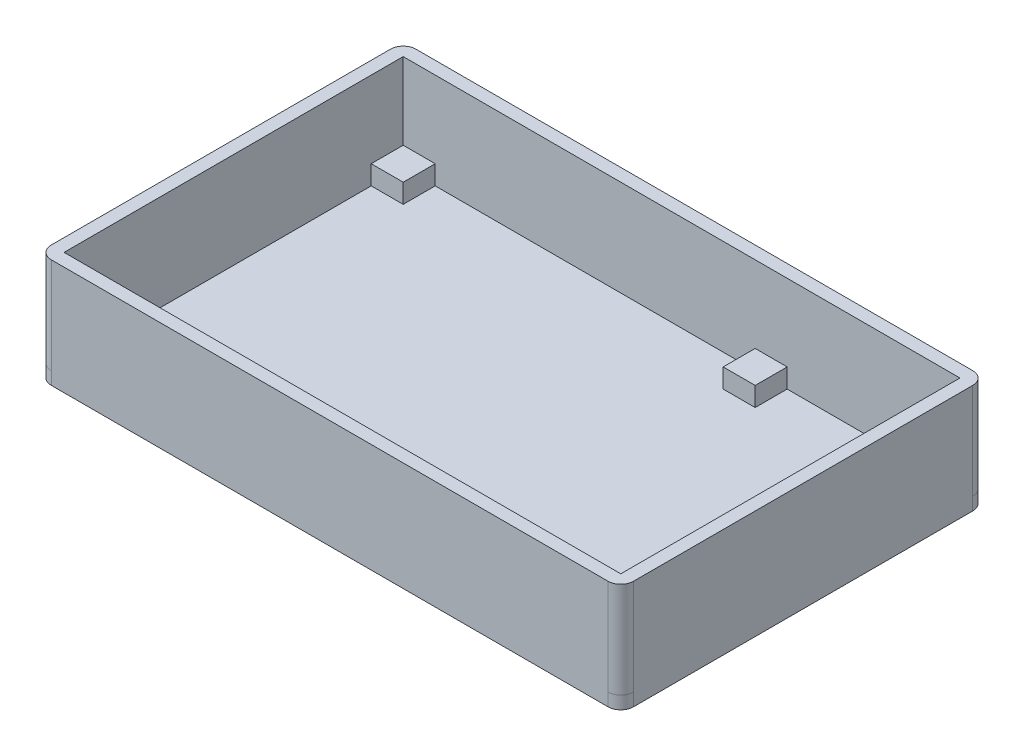
ISO-10303-21;
HEADER;
FILE_DESCRIPTION(('STEP AP214'),'2;1');
FILE_NAME('part.step','',(''),(''),'','','');
FILE_SCHEMA(('AUTOMOTIVE_DESIGN { 1 0 10303 214 1 1 1 1 }'));
ENDSEC;
DATA;
#1=APPLICATION_CONTEXT('core data for automotive mechanical design processes');
#2=APPLICATION_PROTOCOL_DEFINITION('international standard','automotive_design',2000,#1);
#3=PRODUCT_CONTEXT('',#1,'mechanical');
#4=PRODUCT('Part','Part','',(#3));
#5=PRODUCT_RELATED_PRODUCT_CATEGORY('part','',(#4));
#6=PRODUCT_DEFINITION_FORMATION('','',#4);
#7=PRODUCT_DEFINITION_CONTEXT('part definition',#1,'design');
#8=PRODUCT_DEFINITION('design','',#6,#7);
#9=PRODUCT_DEFINITION_SHAPE('','',#8);
#10=(LENGTH_UNIT() NAMED_UNIT(*) SI_UNIT(.MILLI.,.METRE.));
#11=(NAMED_UNIT(*) PLANE_ANGLE_UNIT() SI_UNIT($,.RADIAN.));
#12=(NAMED_UNIT(*) SI_UNIT($,.STERADIAN.) SOLID_ANGLE_UNIT());
#13=UNCERTAINTY_MEASURE_WITH_UNIT(LENGTH_MEASURE(1.E-05),#10,'distance_accuracy_value','');
#14=(GEOMETRIC_REPRESENTATION_CONTEXT(3) GLOBAL_UNCERTAINTY_ASSIGNED_CONTEXT((#13)) GLOBAL_UNIT_ASSIGNED_CONTEXT((#10,
#11,#12)) REPRESENTATION_CONTEXT('',''));
#15=CARTESIAN_POINT('',(0.,0.,0.));
#16=DIRECTION('',(0.,0.,1.));
#17=DIRECTION('',(1.,0.,0.));
#18=AXIS2_PLACEMENT_3D('',#15,#16,#17);
#19=CARTESIAN_POINT('',(0.,2.,0.));
#20=DIRECTION('',(0.,-1.,0.));
#21=DIRECTION('',(0.,0.,-1.));
#22=AXIS2_PLACEMENT_3D('',#19,#20,#21);
#23=PLANE('',#22);
#24=DIRECTION('',(0.,0.,1.));
#25=VECTOR('',#24,1.);
#26=CARTESIAN_POINT('',(57.,2.,-2.));
#27=LINE('',#26,#25);
#28=CARTESIAN_POINT('',(57.,2.,-7.));
#29=VERTEX_POINT('',#28);
#30=CARTESIAN_POINT('',(57.,2.,-2.));
#31=VERTEX_POINT('',#30);
#32=EDGE_CURVE('E620',#29,#31,#27,.T.);
#33=ORIENTED_EDGE('',*,*,#32,.F.);
#34=DIRECTION('',(-1.,0.,0.));
#35=VECTOR('',#34,1.);
#36=CARTESIAN_POINT('',(57.,2.,-7.));
#37=LINE('',#36,#35);
#38=CARTESIAN_POINT('',(62.,2.,-7.));
#39=VERTEX_POINT('',#38);
#40=EDGE_CURVE('E619',#39,#29,#37,.T.);
#41=ORIENTED_EDGE('',*,*,#40,.F.);
#42=DIRECTION('',(0.,0.,-1.));
#43=VECTOR('',#42,1.);
#44=CARTESIAN_POINT('',(62.,2.,-2.));
#45=LINE('',#44,#43);
#46=CARTESIAN_POINT('',(62.,2.,-2.));
#47=VERTEX_POINT('',#46);
#48=EDGE_CURVE('E618',#47,#39,#45,.T.);
#49=ORIENTED_EDGE('',*,*,#48,.F.);
#50=DIRECTION('',(1.,0.,0.));
#51=VECTOR('',#50,1.);
#52=CARTESIAN_POINT('',(0.,2.,-2.));
#53=LINE('',#52,#51);
#54=CARTESIAN_POINT('',(89.,2.,-2.));
#55=VERTEX_POINT('',#54);
#56=EDGE_CURVE('E253',#47,#55,#53,.T.);
#57=ORIENTED_EDGE('',*,*,#56,.T.);
#58=DIRECTION('',(0.,0.,1.));
#59=VECTOR('',#58,1.);
#60=CARTESIAN_POINT('',(89.,2.,0.));
#61=LINE('',#60,#59);
#62=CARTESIAN_POINT('',(89.,2.,-55.));
#63=VERTEX_POINT('',#62);
#64=EDGE_CURVE('E359',#63,#55,#61,.T.);
#65=ORIENTED_EDGE('',*,*,#64,.F.);
#66=DIRECTION('',(1.,0.,0.));
#67=VECTOR('',#66,1.);
#68=CARTESIAN_POINT('',(0.,2.,-55.));
#69=LINE('',#68,#67);
#70=CARTESIAN_POINT('',(62.,2.,-55.));
#71=VERTEX_POINT('',#70);
#72=EDGE_CURVE('E330',#71,#63,#69,.T.);
#73=ORIENTED_EDGE('',*,*,#72,.F.);
#74=DIRECTION('',(0.,0.,-1.));
#75=VECTOR('',#74,1.);
#76=CARTESIAN_POINT('',(62.,2.,-55.));
#77=LINE('',#76,#75);
#78=CARTESIAN_POINT('',(62.,2.,-50.));
#79=VERTEX_POINT('',#78);
#80=EDGE_CURVE('E265',#79,#71,#77,.T.);
#81=ORIENTED_EDGE('',*,*,#80,.F.);
#82=DIRECTION('',(1.,0.,0.));
#83=VECTOR('',#82,1.);
#84=CARTESIAN_POINT('',(57.,2.,-50.));
#85=LINE('',#84,#83);
#86=CARTESIAN_POINT('',(57.,2.,-50.));
#87=VERTEX_POINT('',#86);
#88=EDGE_CURVE('E274',#87,#79,#85,.T.);
#89=ORIENTED_EDGE('',*,*,#88,.F.);
#90=DIRECTION('',(0.,0.,1.));
#91=VECTOR('',#90,1.);
#92=CARTESIAN_POINT('',(57.,2.,-55.));
#93=LINE('',#92,#91);
#94=CARTESIAN_POINT('',(57.,2.,-55.));
#95=VERTEX_POINT('',#94);
#96=EDGE_CURVE('E255',#95,#87,#93,.T.);
#97=ORIENTED_EDGE('',*,*,#96,.F.);
#98=CARTESIAN_POINT('',(7.,2.,-55.));
#99=VERTEX_POINT('',#98);
#100=EDGE_CURVE('E356',#99,#95,#69,.T.);
#101=ORIENTED_EDGE('',*,*,#100,.F.);
#102=DIRECTION('',(0.,0.,-1.));
#103=VECTOR('',#102,1.);
#104=CARTESIAN_POINT('',(7.,2.,-55.));
#105=LINE('',#104,#103);
#106=CARTESIAN_POINT('',(7.,2.,-50.));
#107=VERTEX_POINT('',#106);
#108=EDGE_CURVE('E309',#107,#99,#105,.T.);
#109=ORIENTED_EDGE('',*,*,#108,.F.);
#110=DIRECTION('',(1.,0.,0.));
#111=VECTOR('',#110,1.);
#112=CARTESIAN_POINT('',(2.,2.,-50.));
#113=LINE('',#112,#111);
#114=CARTESIAN_POINT('',(2.,2.,-50.));
#115=VERTEX_POINT('',#114);
#116=EDGE_CURVE('E304',#115,#107,#113,.T.);
#117=ORIENTED_EDGE('',*,*,#116,.F.);
#118=DIRECTION('',(0.,0.,1.));
#119=VECTOR('',#118,1.);
#120=CARTESIAN_POINT('',(2.00000000000001,2.,0.));
#121=LINE('',#120,#119);
#122=CARTESIAN_POINT('',(2.00000000000001,2.,-7.));
#123=VERTEX_POINT('',#122);
#124=EDGE_CURVE('E335',#115,#123,#121,.T.);
#125=ORIENTED_EDGE('',*,*,#124,.T.);
#126=DIRECTION('',(-1.,0.,0.));
#127=VECTOR('',#126,1.);
#128=CARTESIAN_POINT('',(2.00000000000001,2.,-7.));
#129=LINE('',#128,#127);
#130=CARTESIAN_POINT('',(7.00000000000001,2.,-7.));
#131=VERTEX_POINT('',#130);
#132=EDGE_CURVE('E288',#131,#123,#129,.T.);
#133=ORIENTED_EDGE('',*,*,#132,.F.);
#134=DIRECTION('',(0.,0.,-1.));
#135=VECTOR('',#134,1.);
#136=CARTESIAN_POINT('',(7.00000000000001,2.,-2.));
#137=LINE('',#136,#135);
#138=CARTESIAN_POINT('',(7.00000000000001,2.,-2.));
#139=VERTEX_POINT('',#138);
#140=EDGE_CURVE('E284',#139,#131,#137,.T.);
#141=ORIENTED_EDGE('',*,*,#140,.F.);
#142=EDGE_CURVE('E362',#139,#31,#53,.T.);
#143=ORIENTED_EDGE('',*,*,#142,.T.);
#144=EDGE_LOOP('',(#33,#41,#49,#57,#65,#73,#81,#89,#97,#101,#109,#117,#125,#133,#141,#143));
#145=FACE_BOUND('',#144,.T.);
#146=ADVANCED_FACE('F35',(#145),#23,.F.);
#147=CARTESIAN_POINT('',(0.,17.,-2.));
#148=DIRECTION('',(0.,0.,-1.));
#149=DIRECTION('',(-1.,0.,0.));
#150=AXIS2_PLACEMENT_3D('',#147,#148,#149);
#151=PLANE('',#150);
#152=DIRECTION('',(1.,0.,0.));
#153=VECTOR('',#152,1.);
#154=CARTESIAN_POINT('',(57.,5.,-2.));
#155=LINE('',#154,#153);
#156=CARTESIAN_POINT('',(57.,5.,-2.));
#157=VERTEX_POINT('',#156);
#158=CARTESIAN_POINT('',(62.,5.,-2.));
#159=VERTEX_POINT('',#158);
#160=EDGE_CURVE('E232',#157,#159,#155,.T.);
#161=ORIENTED_EDGE('',*,*,#160,.F.);
#162=DIRECTION('',(0.,-1.,0.));
#163=VECTOR('',#162,1.);
#164=CARTESIAN_POINT('',(57.,5.,-2.));
#165=LINE('',#164,#163);
#166=EDGE_CURVE('E50',#157,#31,#165,.T.);
#167=ORIENTED_EDGE('',*,*,#166,.T.);
#168=ORIENTED_EDGE('',*,*,#142,.F.);
#169=DIRECTION('',(0.,-1.,0.));
#170=VECTOR('',#169,1.);
#171=CARTESIAN_POINT('',(7.00000000000001,5.,-2.));
#172=LINE('',#171,#170);
#173=CARTESIAN_POINT('',(7.00000000000001,5.,-2.));
#174=VERTEX_POINT('',#173);
#175=EDGE_CURVE('E302',#174,#139,#172,.T.);
#176=ORIENTED_EDGE('',*,*,#175,.F.);
#177=DIRECTION('',(1.,0.,0.));
#178=VECTOR('',#177,1.);
#179=CARTESIAN_POINT('',(2.00000000000001,5.,-2.));
#180=LINE('',#179,#178);
#181=CARTESIAN_POINT('',(2.00000000000001,5.,-2.));
#182=VERTEX_POINT('',#181);
#183=EDGE_CURVE('E287',#182,#174,#180,.T.);
#184=ORIENTED_EDGE('',*,*,#183,.F.);
#185=DIRECTION('',(0.,-1.,0.));
#186=VECTOR('',#185,1.);
#187=CARTESIAN_POINT('',(2.00000000000001,17.,-2.));
#188=LINE('',#187,#186);
#189=CARTESIAN_POINT('',(2.00000000000001,17.,-2.));
#190=VERTEX_POINT('',#189);
#191=EDGE_CURVE('E369',#190,#182,#188,.T.);
#192=ORIENTED_EDGE('',*,*,#191,.F.);
#193=DIRECTION('',(1.,0.,0.));
#194=VECTOR('',#193,1.);
#195=CARTESIAN_POINT('',(0.,17.,-2.));
#196=LINE('',#195,#194);
#197=CARTESIAN_POINT('',(89.,17.,-2.));
#198=VERTEX_POINT('',#197);
#199=EDGE_CURVE('E349',#190,#198,#196,.T.);
#200=ORIENTED_EDGE('',*,*,#199,.T.);
#201=DIRECTION('',(0.,-1.,0.));
#202=VECTOR('',#201,1.);
#203=CARTESIAN_POINT('',(89.,17.,-2.));
#204=LINE('',#203,#202);
#205=EDGE_CURVE('E372',#198,#55,#204,.T.);
#206=ORIENTED_EDGE('',*,*,#205,.T.);
#207=ORIENTED_EDGE('',*,*,#56,.F.);
#208=DIRECTION('',(0.,-1.,0.));
#209=VECTOR('',#208,1.);
#210=CARTESIAN_POINT('',(62.,5.,-2.));
#211=LINE('',#210,#209);
#212=EDGE_CURVE('E243',#159,#47,#211,.T.);
#213=ORIENTED_EDGE('',*,*,#212,.F.);
#214=EDGE_LOOP('',(#161,#167,#168,#176,#184,#192,#200,#206,#207,#213));
#215=FACE_BOUND('',#214,.T.);
#216=ADVANCED_FACE('F251',(#215),#151,.T.);
#217=CARTESIAN_POINT('',(0.,17.,-55.));
#218=DIRECTION('',(0.,0.,-1.));
#219=DIRECTION('',(-1.,0.,0.));
#220=AXIS2_PLACEMENT_3D('',#217,#218,#219);
#221=PLANE('',#220);
#222=DIRECTION('',(0.,-1.,0.));
#223=VECTOR('',#222,1.);
#224=CARTESIAN_POINT('',(57.,5.,-55.));
#225=LINE('',#224,#223);
#226=CARTESIAN_POINT('',(57.,5.,-55.));
#227=VERTEX_POINT('',#226);
#228=EDGE_CURVE('E271',#227,#95,#225,.T.);
#229=ORIENTED_EDGE('',*,*,#228,.F.);
#230=DIRECTION('',(-1.,0.,0.));
#231=VECTOR('',#230,1.);
#232=CARTESIAN_POINT('',(57.,5.,-55.));
#233=LINE('',#232,#231);
#234=CARTESIAN_POINT('',(62.,5.,-55.));
#235=VERTEX_POINT('',#234);
#236=EDGE_CURVE('E269',#235,#227,#233,.T.);
#237=ORIENTED_EDGE('',*,*,#236,.F.);
#238=DIRECTION('',(0.,-1.,0.));
#239=VECTOR('',#238,1.);
#240=CARTESIAN_POINT('',(62.,5.,-55.));
#241=LINE('',#240,#239);
#242=EDGE_CURVE('E58',#235,#71,#241,.T.);
#243=ORIENTED_EDGE('',*,*,#242,.T.);
#244=ORIENTED_EDGE('',*,*,#72,.T.);
#245=DIRECTION('',(0.,-1.,0.));
#246=VECTOR('',#245,1.);
#247=CARTESIAN_POINT('',(89.,17.,-55.));
#248=LINE('',#247,#246);
#249=CARTESIAN_POINT('',(89.,17.,-55.));
#250=VERTEX_POINT('',#249);
#251=EDGE_CURVE('E374',#250,#63,#248,.T.);
#252=ORIENTED_EDGE('',*,*,#251,.F.);
#253=DIRECTION('',(1.,0.,0.));
#254=VECTOR('',#253,1.);
#255=CARTESIAN_POINT('',(0.,17.,-55.));
#256=LINE('',#255,#254);
#257=CARTESIAN_POINT('',(2.,17.,-55.));
#258=VERTEX_POINT('',#257);
#259=EDGE_CURVE('E344',#258,#250,#256,.T.);
#260=ORIENTED_EDGE('',*,*,#259,.F.);
#261=DIRECTION('',(0.,-1.,0.));
#262=VECTOR('',#261,1.);
#263=CARTESIAN_POINT('',(2.,17.,-55.));
#264=LINE('',#263,#262);
#265=CARTESIAN_POINT('',(2.,5.,-55.));
#266=VERTEX_POINT('',#265);
#267=EDGE_CURVE('E355',#258,#266,#264,.T.);
#268=ORIENTED_EDGE('',*,*,#267,.T.);
#269=DIRECTION('',(-1.,0.,0.));
#270=VECTOR('',#269,1.);
#271=CARTESIAN_POINT('',(2.,5.,-55.));
#272=LINE('',#271,#270);
#273=CARTESIAN_POINT('',(7.,5.,-55.));
#274=VERTEX_POINT('',#273);
#275=EDGE_CURVE('E314',#274,#266,#272,.T.);
#276=ORIENTED_EDGE('',*,*,#275,.F.);
#277=DIRECTION('',(0.,-1.,0.));
#278=VECTOR('',#277,1.);
#279=CARTESIAN_POINT('',(7.,5.,-55.));
#280=LINE('',#279,#278);
#281=EDGE_CURVE('E317',#274,#99,#280,.T.);
#282=ORIENTED_EDGE('',*,*,#281,.T.);
#283=ORIENTED_EDGE('',*,*,#100,.T.);
#284=EDGE_LOOP('',(#229,#237,#243,#244,#252,#260,#268,#276,#282,#283));
#285=FACE_BOUND('',#284,.T.);
#286=ADVANCED_FACE('F518',(#285),#221,.F.);
#287=CARTESIAN_POINT('',(2.00000000000001,17.,0.));
#288=DIRECTION('',(1.,0.,0.));
#289=DIRECTION('',(0.,0.,-1.));
#290=AXIS2_PLACEMENT_3D('',#287,#288,#289);
#291=PLANE('',#290);
#292=DIRECTION('',(0.,0.,1.));
#293=VECTOR('',#292,1.);
#294=CARTESIAN_POINT('',(2.00000000000001,5.,-2.));
#295=LINE('',#294,#293);
#296=CARTESIAN_POINT('',(2.00000000000001,5.,-7.));
#297=VERTEX_POINT('',#296);
#298=EDGE_CURVE('E285',#297,#182,#295,.T.);
#299=ORIENTED_EDGE('',*,*,#298,.F.);
#300=DIRECTION('',(0.,-1.,0.));
#301=VECTOR('',#300,1.);
#302=CARTESIAN_POINT('',(2.00000000000001,5.,-7.));
#303=LINE('',#302,#301);
#304=EDGE_CURVE('E294',#297,#123,#303,.T.);
#305=ORIENTED_EDGE('',*,*,#304,.T.);
#306=ORIENTED_EDGE('',*,*,#124,.F.);
#307=DIRECTION('',(0.,-1.,0.));
#308=VECTOR('',#307,1.);
#309=CARTESIAN_POINT('',(2.,5.,-50.));
#310=LINE('',#309,#308);
#311=CARTESIAN_POINT('',(2.,5.,-50.));
#312=VERTEX_POINT('',#311);
#313=EDGE_CURVE('E327',#312,#115,#310,.T.);
#314=ORIENTED_EDGE('',*,*,#313,.F.);
#315=DIRECTION('',(0.,0.,1.));
#316=VECTOR('',#315,1.);
#317=CARTESIAN_POINT('',(2.,5.,-55.));
#318=LINE('',#317,#316);
#319=EDGE_CURVE('E305',#266,#312,#318,.T.);
#320=ORIENTED_EDGE('',*,*,#319,.F.);
#321=ORIENTED_EDGE('',*,*,#267,.F.);
#322=DIRECTION('',(0.,0.,1.));
#323=VECTOR('',#322,1.);
#324=CARTESIAN_POINT('',(2.00000000000001,17.,0.));
#325=LINE('',#324,#323);
#326=EDGE_CURVE('E352',#258,#190,#325,.T.);
#327=ORIENTED_EDGE('',*,*,#326,.T.);
#328=ORIENTED_EDGE('',*,*,#191,.T.);
#329=EDGE_LOOP('',(#299,#305,#306,#314,#320,#321,#327,#328));
#330=FACE_BOUND('',#329,.T.);
#331=ADVANCED_FACE('F534',(#330),#291,.T.);
#332=CARTESIAN_POINT('',(0.,2.,0.));
#333=DIRECTION('',(1.,0.,0.));
#334=DIRECTION('',(0.,0.,-1.));
#335=AXIS2_PLACEMENT_3D('',#332,#333,#334);
#336=PLANE('',#335);
#337=DIRECTION('',(0.,0.,1.));
#338=VECTOR('',#337,1.);
#339=CARTESIAN_POINT('',(0.,17.,0.));
#340=LINE('',#339,#338);
#341=CARTESIAN_POINT('',(0.,17.,-55.));
#342=VERTEX_POINT('',#341);
#343=CARTESIAN_POINT('',(0.,17.,-2.));
#344=VERTEX_POINT('',#343);
#345=EDGE_CURVE('E334',#342,#344,#340,.T.);
#346=ORIENTED_EDGE('',*,*,#345,.F.);
#347=DIRECTION('',(0.,-1.,0.));
#348=VECTOR('',#347,1.);
#349=CARTESIAN_POINT('',(0.,2.,-55.));
#350=LINE('',#349,#348);
#351=CARTESIAN_POINT('',(0.,2.,-55.));
#352=VERTEX_POINT('',#351);
#353=EDGE_CURVE('E427',#342,#352,#350,.T.);
#354=ORIENTED_EDGE('',*,*,#353,.T.);
#355=DIRECTION('',(0.,-1.,0.));
#356=VECTOR('',#355,1.);
#357=CARTESIAN_POINT('',(0.,2.,-55.));
#358=LINE('',#357,#356);
#359=CARTESIAN_POINT('',(0.,0.,-55.));
#360=VERTEX_POINT('',#359);
#361=EDGE_CURVE('E391',#352,#360,#358,.T.);
#362=ORIENTED_EDGE('',*,*,#361,.T.);
#363=DIRECTION('',(0.,0.,1.));
#364=VECTOR('',#363,1.);
#365=CARTESIAN_POINT('',(0.,0.,0.));
#366=LINE('',#365,#364);
#367=CARTESIAN_POINT('',(0.,0.,-2.));
#368=VERTEX_POINT('',#367);
#369=EDGE_CURVE('E377',#360,#368,#366,.T.);
#370=ORIENTED_EDGE('',*,*,#369,.T.);
#371=DIRECTION('',(0.,-1.,0.));
#372=VECTOR('',#371,1.);
#373=CARTESIAN_POINT('',(0.,2.,-2.));
#374=LINE('',#373,#372);
#375=CARTESIAN_POINT('',(0.,2.,-2.));
#376=VERTEX_POINT('',#375);
#377=EDGE_CURVE('E389',#368,#376,#374,.F.);
#378=ORIENTED_EDGE('',*,*,#377,.T.);
#379=DIRECTION('',(0.,-1.,0.));
#380=VECTOR('',#379,1.);
#381=CARTESIAN_POINT('',(0.,2.,-2.));
#382=LINE('',#381,#380);
#383=EDGE_CURVE('E425',#376,#344,#382,.F.);
#384=ORIENTED_EDGE('',*,*,#383,.T.);
#385=EDGE_LOOP('',(#346,#354,#362,#370,#378,#384));
#386=FACE_BOUND('',#385,.T.);
#387=ADVANCED_FACE('F466',(#386),#336,.F.);
#388=CARTESIAN_POINT('',(0.,2.,0.));
#389=DIRECTION('',(0.,0.,-1.));
#390=DIRECTION('',(-1.,0.,0.));
#391=AXIS2_PLACEMENT_3D('',#388,#389,#390);
#392=PLANE('',#391);
#393=DIRECTION('',(0.,-1.,0.));
#394=VECTOR('',#393,1.);
#395=CARTESIAN_POINT('',(89.,2.,0.));
#396=LINE('',#395,#394);
#397=CARTESIAN_POINT('',(89.,0.,0.));
#398=VERTEX_POINT('',#397);
#399=CARTESIAN_POINT('',(89.,2.,0.));
#400=VERTEX_POINT('',#399);
#401=EDGE_CURVE('E423',#398,#400,#396,.F.);
#402=ORIENTED_EDGE('',*,*,#401,.T.);
#403=DIRECTION('',(0.,-1.,0.));
#404=VECTOR('',#403,1.);
#405=CARTESIAN_POINT('',(89.,2.,0.));
#406=LINE('',#405,#404);
#407=CARTESIAN_POINT('',(89.,17.,0.));
#408=VERTEX_POINT('',#407);
#409=EDGE_CURVE('E11',#400,#408,#406,.F.);
#410=ORIENTED_EDGE('',*,*,#409,.T.);
#411=DIRECTION('',(1.,0.,0.));
#412=VECTOR('',#411,1.);
#413=CARTESIAN_POINT('',(0.,17.,0.));
#414=LINE('',#413,#412);
#415=CARTESIAN_POINT('',(2.,17.,0.));
#416=VERTEX_POINT('',#415);
#417=EDGE_CURVE('E338',#416,#408,#414,.T.);
#418=ORIENTED_EDGE('',*,*,#417,.F.);
#419=DIRECTION('',(0.,-1.,0.));
#420=VECTOR('',#419,1.);
#421=CARTESIAN_POINT('',(2.,2.,0.));
#422=LINE('',#421,#420);
#423=CARTESIAN_POINT('',(2.,2.,0.));
#424=VERTEX_POINT('',#423);
#425=EDGE_CURVE('E43',#416,#424,#422,.T.);
#426=ORIENTED_EDGE('',*,*,#425,.T.);
#427=DIRECTION('',(0.,-1.,0.));
#428=VECTOR('',#427,1.);
#429=CARTESIAN_POINT('',(2.,2.,0.));
#430=LINE('',#429,#428);
#431=CARTESIAN_POINT('',(2.,0.,0.));
#432=VERTEX_POINT('',#431);
#433=EDGE_CURVE('E420',#424,#432,#430,.T.);
#434=ORIENTED_EDGE('',*,*,#433,.T.);
#435=DIRECTION('',(1.,0.,0.));
#436=VECTOR('',#435,1.);
#437=CARTESIAN_POINT('',(0.,0.,0.));
#438=LINE('',#437,#436);
#439=EDGE_CURVE('E380',#432,#398,#438,.T.);
#440=ORIENTED_EDGE('',*,*,#439,.T.);
#441=EDGE_LOOP('',(#402,#410,#418,#426,#434,#440));
#442=FACE_BOUND('',#441,.T.);
#443=ADVANCED_FACE('F452',(#442),#392,.F.);
#444=CARTESIAN_POINT('',(91.,2.,0.));
#445=DIRECTION('',(-1.,0.,0.));
#446=DIRECTION('',(0.,0.,1.));
#447=AXIS2_PLACEMENT_3D('',#444,#445,#446);
#448=PLANE('',#447);
#449=DIRECTION('',(0.,-1.,0.));
#450=VECTOR('',#449,1.);
#451=CARTESIAN_POINT('',(91.,2.,-55.));
#452=LINE('',#451,#450);
#453=CARTESIAN_POINT('',(91.,0.,-55.));
#454=VERTEX_POINT('',#453);
#455=CARTESIAN_POINT('',(91.,2.,-55.));
#456=VERTEX_POINT('',#455);
#457=EDGE_CURVE('E418',#454,#456,#452,.F.);
#458=ORIENTED_EDGE('',*,*,#457,.T.);
#459=DIRECTION('',(0.,-1.,0.));
#460=VECTOR('',#459,1.);
#461=CARTESIAN_POINT('',(91.,2.,-55.));
#462=LINE('',#461,#460);
#463=CARTESIAN_POINT('',(91.,17.,-55.));
#464=VERTEX_POINT('',#463);
#465=EDGE_CURVE('E446',#456,#464,#462,.F.);
#466=ORIENTED_EDGE('',*,*,#465,.T.);
#467=DIRECTION('',(0.,0.,-1.));
#468=VECTOR('',#467,1.);
#469=CARTESIAN_POINT('',(91.,17.,0.));
#470=LINE('',#469,#468);
#471=CARTESIAN_POINT('',(91.,17.,-2.));
#472=VERTEX_POINT('',#471);
#473=EDGE_CURVE('E341',#472,#464,#470,.T.);
#474=ORIENTED_EDGE('',*,*,#473,.F.);
#475=DIRECTION('',(0.,-1.,0.));
#476=VECTOR('',#475,1.);
#477=CARTESIAN_POINT('',(91.,2.,-2.));
#478=LINE('',#477,#476);
#479=CARTESIAN_POINT('',(91.,2.,-2.));
#480=VERTEX_POINT('',#479);
#481=EDGE_CURVE('E443',#472,#480,#478,.T.);
#482=ORIENTED_EDGE('',*,*,#481,.T.);
#483=DIRECTION('',(0.,-1.,0.));
#484=VECTOR('',#483,1.);
#485=CARTESIAN_POINT('',(91.,2.,-2.));
#486=LINE('',#485,#484);
#487=CARTESIAN_POINT('',(91.,0.,-2.));
#488=VERTEX_POINT('',#487);
#489=EDGE_CURVE('E415',#480,#488,#486,.T.);
#490=ORIENTED_EDGE('',*,*,#489,.T.);
#491=DIRECTION('',(0.,0.,-1.));
#492=VECTOR('',#491,1.);
#493=CARTESIAN_POINT('',(91.,0.,0.));
#494=LINE('',#493,#492);
#495=EDGE_CURVE('E383',#488,#454,#494,.T.);
#496=ORIENTED_EDGE('',*,*,#495,.T.);
#497=EDGE_LOOP('',(#458,#466,#474,#482,#490,#496));
#498=FACE_BOUND('',#497,.T.);
#499=ADVANCED_FACE('F487',(#498),#448,.F.);
#500=CARTESIAN_POINT('',(0.,2.,-57.));
#501=DIRECTION('',(0.,0.,1.));
#502=DIRECTION('',(1.,0.,0.));
#503=AXIS2_PLACEMENT_3D('',#500,#501,#502);
#504=PLANE('',#503);
#505=DIRECTION('',(0.,-1.,0.));
#506=VECTOR('',#505,1.);
#507=CARTESIAN_POINT('',(2.,2.,-57.));
#508=LINE('',#507,#506);
#509=CARTESIAN_POINT('',(2.,0.,-57.));
#510=VERTEX_POINT('',#509);
#511=CARTESIAN_POINT('',(2.,2.,-57.));
#512=VERTEX_POINT('',#511);
#513=EDGE_CURVE('E405',#510,#512,#508,.F.);
#514=ORIENTED_EDGE('',*,*,#513,.T.);
#515=DIRECTION('',(0.,-1.,0.));
#516=VECTOR('',#515,1.);
#517=CARTESIAN_POINT('',(2.,2.,-57.));
#518=LINE('',#517,#516);
#519=CARTESIAN_POINT('',(2.,17.,-57.));
#520=VERTEX_POINT('',#519);
#521=EDGE_CURVE('E433',#512,#520,#518,.F.);
#522=ORIENTED_EDGE('',*,*,#521,.T.);
#523=DIRECTION('',(-1.,0.,0.));
#524=VECTOR('',#523,1.);
#525=CARTESIAN_POINT('',(0.,17.,-57.));
#526=LINE('',#525,#524);
#527=CARTESIAN_POINT('',(89.,17.,-57.));
#528=VERTEX_POINT('',#527);
#529=EDGE_CURVE('E331',#528,#520,#526,.T.);
#530=ORIENTED_EDGE('',*,*,#529,.F.);
#531=DIRECTION('',(0.,-1.,0.));
#532=VECTOR('',#531,1.);
#533=CARTESIAN_POINT('',(89.,2.,-57.));
#534=LINE('',#533,#532);
#535=CARTESIAN_POINT('',(89.,2.,-57.));
#536=VERTEX_POINT('',#535);
#537=EDGE_CURVE('E430',#528,#536,#534,.T.);
#538=ORIENTED_EDGE('',*,*,#537,.T.);
#539=DIRECTION('',(0.,-1.,0.));
#540=VECTOR('',#539,1.);
#541=CARTESIAN_POINT('',(89.,2.,-57.));
#542=LINE('',#541,#540);
#543=CARTESIAN_POINT('',(89.,0.,-57.));
#544=VERTEX_POINT('',#543);
#545=EDGE_CURVE('E402',#536,#544,#542,.T.);
#546=ORIENTED_EDGE('',*,*,#545,.T.);
#547=DIRECTION('',(-1.,0.,0.));
#548=VECTOR('',#547,1.);
#549=CARTESIAN_POINT('',(0.,0.,-57.));
#550=LINE('',#549,#548);
#551=EDGE_CURVE('E386',#544,#510,#550,.T.);
#552=ORIENTED_EDGE('',*,*,#551,.T.);
#553=EDGE_LOOP('',(#514,#522,#530,#538,#546,#552));
#554=FACE_BOUND('',#553,.T.);
#555=ADVANCED_FACE('F476',(#554),#504,.F.);
#556=CARTESIAN_POINT('',(0.,0.,0.));
#557=DIRECTION('',(0.,-1.,0.));
#558=DIRECTION('',(0.,0.,-1.));
#559=AXIS2_PLACEMENT_3D('',#556,#557,#558);
#560=PLANE('',#559);
#561=ORIENTED_EDGE('',*,*,#369,.F.);
#562=CARTESIAN_POINT('',(2.,0.,-55.));
#563=DIRECTION('',(0.,-1.,0.));
#564=DIRECTION('',(0.,0.,-1.));
#565=AXIS2_PLACEMENT_3D('',#562,#563,#564);
#566=CIRCLE('',#565,2.);
#567=EDGE_CURVE('E400',#360,#510,#566,.T.);
#568=ORIENTED_EDGE('',*,*,#567,.T.);
#569=ORIENTED_EDGE('',*,*,#551,.F.);
#570=CARTESIAN_POINT('',(89.,0.,-55.));
#571=DIRECTION('',(0.,-1.,0.));
#572=DIRECTION('',(0.,0.,-1.));
#573=AXIS2_PLACEMENT_3D('',#570,#571,#572);
#574=CIRCLE('',#573,2.);
#575=EDGE_CURVE('E398',#544,#454,#574,.T.);
#576=ORIENTED_EDGE('',*,*,#575,.T.);
#577=ORIENTED_EDGE('',*,*,#495,.F.);
#578=CARTESIAN_POINT('',(89.,0.,-2.));
#579=DIRECTION('',(0.,-1.,0.));
#580=DIRECTION('',(0.,0.,-1.));
#581=AXIS2_PLACEMENT_3D('',#578,#579,#580);
#582=CIRCLE('',#581,2.);
#583=EDGE_CURVE('E396',#488,#398,#582,.T.);
#584=ORIENTED_EDGE('',*,*,#583,.T.);
#585=ORIENTED_EDGE('',*,*,#439,.F.);
#586=CARTESIAN_POINT('',(2.,0.,-2.));
#587=DIRECTION('',(0.,-1.,0.));
#588=DIRECTION('',(0.,0.,-1.));
#589=AXIS2_PLACEMENT_3D('',#586,#587,#588);
#590=CIRCLE('',#589,2.);
#591=EDGE_CURVE('E394',#432,#368,#590,.T.);
#592=ORIENTED_EDGE('',*,*,#591,.T.);
#593=EDGE_LOOP('',(#561,#568,#569,#576,#577,#584,#585,#592));
#594=FACE_BOUND('',#593,.T.);
#595=ADVANCED_FACE('F463',(#594),#560,.T.);
#596=CARTESIAN_POINT('',(2.,2.,-55.));
#597=DIRECTION('',(0.,-1.,0.));
#598=DIRECTION('',(0.,0.,-1.));
#599=AXIS2_PLACEMENT_3D('',#596,#597,#598);
#600=CYLINDRICAL_SURFACE('',#599,2.);
#601=CARTESIAN_POINT('',(2.,2.,-55.));
#602=DIRECTION('',(0.,-1.,0.));
#603=DIRECTION('',(0.,0.,-1.));
#604=AXIS2_PLACEMENT_3D('',#601,#602,#603);
#605=CIRCLE('',#604,2.);
#606=EDGE_CURVE('E413',#512,#352,#605,.F.);
#607=ORIENTED_EDGE('',*,*,#606,.F.);
#608=ORIENTED_EDGE('',*,*,#513,.F.);
#609=ORIENTED_EDGE('',*,*,#567,.F.);
#610=ORIENTED_EDGE('',*,*,#361,.F.);
#611=EDGE_LOOP('',(#607,#608,#609,#610));
#612=FACE_BOUND('',#611,.T.);
#613=ADVANCED_FACE('F471',(#612),#600,.T.);
#614=CARTESIAN_POINT('',(89.,2.,-55.));
#615=DIRECTION('',(0.,-1.,0.));
#616=DIRECTION('',(0.,0.,-1.));
#617=AXIS2_PLACEMENT_3D('',#614,#615,#616);
#618=CYLINDRICAL_SURFACE('',#617,2.);
#619=CARTESIAN_POINT('',(89.,2.,-55.));
#620=DIRECTION('',(0.,-1.,0.));
#621=DIRECTION('',(0.,0.,-1.));
#622=AXIS2_PLACEMENT_3D('',#619,#620,#621);
#623=CIRCLE('',#622,2.);
#624=EDGE_CURVE('E411',#456,#536,#623,.F.);
#625=ORIENTED_EDGE('',*,*,#624,.F.);
#626=ORIENTED_EDGE('',*,*,#457,.F.);
#627=ORIENTED_EDGE('',*,*,#575,.F.);
#628=ORIENTED_EDGE('',*,*,#545,.F.);
#629=EDGE_LOOP('',(#625,#626,#627,#628));
#630=FACE_BOUND('',#629,.T.);
#631=ADVANCED_FACE('F482',(#630),#618,.T.);
#632=CARTESIAN_POINT('',(89.,2.,-2.));
#633=DIRECTION('',(0.,-1.,0.));
#634=DIRECTION('',(0.,0.,-1.));
#635=AXIS2_PLACEMENT_3D('',#632,#633,#634);
#636=CYLINDRICAL_SURFACE('',#635,2.);
#637=CARTESIAN_POINT('',(89.,2.,-2.));
#638=DIRECTION('',(0.,-1.,0.));
#639=DIRECTION('',(0.,0.,-1.));
#640=AXIS2_PLACEMENT_3D('',#637,#638,#639);
#641=CIRCLE('',#640,2.);
#642=EDGE_CURVE('E409',#400,#480,#641,.F.);
#643=ORIENTED_EDGE('',*,*,#642,.F.);
#644=ORIENTED_EDGE('',*,*,#401,.F.);
#645=ORIENTED_EDGE('',*,*,#583,.F.);
#646=ORIENTED_EDGE('',*,*,#489,.F.);
#647=EDGE_LOOP('',(#643,#644,#645,#646));
#648=FACE_BOUND('',#647,.T.);
#649=ADVANCED_FACE('F493',(#648),#636,.T.);
#650=CARTESIAN_POINT('',(2.,2.,-2.));
#651=DIRECTION('',(0.,-1.,0.));
#652=DIRECTION('',(0.,0.,-1.));
#653=AXIS2_PLACEMENT_3D('',#650,#651,#652);
#654=CYLINDRICAL_SURFACE('',#653,2.);
#655=CARTESIAN_POINT('',(2.,2.,-2.));
#656=DIRECTION('',(0.,-1.,0.));
#657=DIRECTION('',(0.,0.,-1.));
#658=AXIS2_PLACEMENT_3D('',#655,#656,#657);
#659=CIRCLE('',#658,2.);
#660=EDGE_CURVE('E407',#376,#424,#659,.F.);
#661=ORIENTED_EDGE('',*,*,#660,.F.);
#662=ORIENTED_EDGE('',*,*,#377,.F.);
#663=ORIENTED_EDGE('',*,*,#591,.F.);
#664=ORIENTED_EDGE('',*,*,#433,.F.);
#665=EDGE_LOOP('',(#661,#662,#663,#664));
#666=FACE_BOUND('',#665,.T.);
#667=ADVANCED_FACE('F458',(#666),#654,.T.);
#668=CARTESIAN_POINT('',(89.,17.,0.));
#669=DIRECTION('',(1.,0.,0.));
#670=DIRECTION('',(0.,0.,-1.));
#671=AXIS2_PLACEMENT_3D('',#668,#669,#670);
#672=PLANE('',#671);
#673=ORIENTED_EDGE('',*,*,#64,.T.);
#674=ORIENTED_EDGE('',*,*,#205,.F.);
#675=DIRECTION('',(0.,0.,1.));
#676=VECTOR('',#675,1.);
#677=CARTESIAN_POINT('',(89.,17.,0.));
#678=LINE('',#677,#676);
#679=EDGE_CURVE('E347',#250,#198,#678,.T.);
#680=ORIENTED_EDGE('',*,*,#679,.F.);
#681=ORIENTED_EDGE('',*,*,#251,.T.);
#682=EDGE_LOOP('',(#673,#674,#680,#681));
#683=FACE_BOUND('',#682,.T.);
#684=ADVANCED_FACE('F543',(#683),#672,.F.);
#685=CARTESIAN_POINT('',(0.,17.,0.));
#686=DIRECTION('',(0.,1.,0.));
#687=DIRECTION('',(0.,0.,1.));
#688=AXIS2_PLACEMENT_3D('',#685,#686,#687);
#689=PLANE('',#688);
#690=ORIENTED_EDGE('',*,*,#529,.T.);
#691=CARTESIAN_POINT('',(2.,17.,-55.));
#692=DIRECTION('',(0.,1.,0.));
#693=DIRECTION('',(0.,0.,1.));
#694=AXIS2_PLACEMENT_3D('',#691,#692,#693);
#695=CIRCLE('',#694,2.);
#696=EDGE_CURVE('E441',#520,#342,#695,.T.);
#697=ORIENTED_EDGE('',*,*,#696,.T.);
#698=ORIENTED_EDGE('',*,*,#345,.T.);
#699=CARTESIAN_POINT('',(2.,17.,-2.));
#700=DIRECTION('',(0.,1.,0.));
#701=DIRECTION('',(0.,0.,1.));
#702=AXIS2_PLACEMENT_3D('',#699,#700,#701);
#703=CIRCLE('',#702,2.);
#704=EDGE_CURVE('E435',#344,#416,#703,.T.);
#705=ORIENTED_EDGE('',*,*,#704,.T.);
#706=ORIENTED_EDGE('',*,*,#417,.T.);
#707=CARTESIAN_POINT('',(89.,17.,-2.));
#708=DIRECTION('',(0.,1.,0.));
#709=DIRECTION('',(0.,0.,1.));
#710=AXIS2_PLACEMENT_3D('',#707,#708,#709);
#711=CIRCLE('',#710,2.);
#712=EDGE_CURVE('E437',#408,#472,#711,.T.);
#713=ORIENTED_EDGE('',*,*,#712,.T.);
#714=ORIENTED_EDGE('',*,*,#473,.T.);
#715=CARTESIAN_POINT('',(89.,17.,-55.));
#716=DIRECTION('',(0.,1.,0.));
#717=DIRECTION('',(0.,0.,1.));
#718=AXIS2_PLACEMENT_3D('',#715,#716,#717);
#719=CIRCLE('',#718,2.);
#720=EDGE_CURVE('E439',#464,#528,#719,.T.);
#721=ORIENTED_EDGE('',*,*,#720,.T.);
#722=EDGE_LOOP('',(#690,#697,#698,#705,#706,#713,#714,#721));
#723=FACE_BOUND('',#722,.T.);
#724=ORIENTED_EDGE('',*,*,#259,.T.);
#725=ORIENTED_EDGE('',*,*,#679,.T.);
#726=ORIENTED_EDGE('',*,*,#199,.F.);
#727=ORIENTED_EDGE('',*,*,#326,.F.);
#728=EDGE_LOOP('',(#724,#725,#726,#727));
#729=FACE_BOUND('',#728,.T.);
#730=ADVANCED_FACE('F499',(#723,#729),#689,.T.);
#731=CARTESIAN_POINT('',(2.,2.,-55.));
#732=DIRECTION('',(0.,-1.,0.));
#733=DIRECTION('',(0.,0.,-1.));
#734=AXIS2_PLACEMENT_3D('',#731,#732,#733);
#735=CYLINDRICAL_SURFACE('',#734,2.);
#736=ORIENTED_EDGE('',*,*,#696,.F.);
#737=ORIENTED_EDGE('',*,*,#521,.F.);
#738=ORIENTED_EDGE('',*,*,#606,.T.);
#739=ORIENTED_EDGE('',*,*,#353,.F.);
#740=EDGE_LOOP('',(#736,#737,#738,#739));
#741=FACE_BOUND('',#740,.T.);
#742=ADVANCED_FACE('F509',(#741),#735,.T.);
#743=CARTESIAN_POINT('',(89.,2.,-55.));
#744=DIRECTION('',(0.,-1.,0.));
#745=DIRECTION('',(0.,0.,-1.));
#746=AXIS2_PLACEMENT_3D('',#743,#744,#745);
#747=CYLINDRICAL_SURFACE('',#746,2.);
#748=ORIENTED_EDGE('',*,*,#720,.F.);
#749=ORIENTED_EDGE('',*,*,#465,.F.);
#750=ORIENTED_EDGE('',*,*,#624,.T.);
#751=ORIENTED_EDGE('',*,*,#537,.F.);
#752=EDGE_LOOP('',(#748,#749,#750,#751));
#753=FACE_BOUND('',#752,.T.);
#754=ADVANCED_FACE('F503',(#753),#747,.T.);
#755=CARTESIAN_POINT('',(89.,2.,-2.));
#756=DIRECTION('',(0.,-1.,0.));
#757=DIRECTION('',(0.,0.,-1.));
#758=AXIS2_PLACEMENT_3D('',#755,#756,#757);
#759=CYLINDRICAL_SURFACE('',#758,2.);
#760=ORIENTED_EDGE('',*,*,#712,.F.);
#761=ORIENTED_EDGE('',*,*,#409,.F.);
#762=ORIENTED_EDGE('',*,*,#642,.T.);
#763=ORIENTED_EDGE('',*,*,#481,.F.);
#764=EDGE_LOOP('',(#760,#761,#762,#763));
#765=FACE_BOUND('',#764,.T.);
#766=ADVANCED_FACE('F501',(#765),#759,.T.);
#767=CARTESIAN_POINT('',(2.,2.,-2.));
#768=DIRECTION('',(0.,-1.,0.));
#769=DIRECTION('',(0.,0.,-1.));
#770=AXIS2_PLACEMENT_3D('',#767,#768,#769);
#771=CYLINDRICAL_SURFACE('',#770,2.);
#772=ORIENTED_EDGE('',*,*,#704,.F.);
#773=ORIENTED_EDGE('',*,*,#383,.F.);
#774=ORIENTED_EDGE('',*,*,#660,.T.);
#775=ORIENTED_EDGE('',*,*,#425,.F.);
#776=EDGE_LOOP('',(#772,#773,#774,#775));
#777=FACE_BOUND('',#776,.T.);
#778=ADVANCED_FACE('F37',(#777),#771,.T.);
#779=CARTESIAN_POINT('',(2.,5.,-50.));
#780=DIRECTION('',(0.,0.,-1.));
#781=DIRECTION('',(-1.,0.,0.));
#782=AXIS2_PLACEMENT_3D('',#779,#780,#781);
#783=PLANE('',#782);
#784=ORIENTED_EDGE('',*,*,#116,.T.);
#785=DIRECTION('',(0.,-1.,0.));
#786=VECTOR('',#785,1.);
#787=CARTESIAN_POINT('',(7.,5.,-50.));
#788=LINE('',#787,#786);
#789=CARTESIAN_POINT('',(7.,5.,-50.));
#790=VERTEX_POINT('',#789);
#791=EDGE_CURVE('E324',#790,#107,#788,.T.);
#792=ORIENTED_EDGE('',*,*,#791,.F.);
#793=DIRECTION('',(1.,0.,0.));
#794=VECTOR('',#793,1.);
#795=CARTESIAN_POINT('',(2.,5.,-50.));
#796=LINE('',#795,#794);
#797=EDGE_CURVE('E308',#312,#790,#796,.T.);
#798=ORIENTED_EDGE('',*,*,#797,.F.);
#799=ORIENTED_EDGE('',*,*,#313,.T.);
#800=EDGE_LOOP('',(#784,#792,#798,#799));
#801=FACE_BOUND('',#800,.T.);
#802=ADVANCED_FACE('F508',(#801),#783,.F.);
#803=CARTESIAN_POINT('',(7.,5.,-55.));
#804=DIRECTION('',(-1.,0.,0.));
#805=DIRECTION('',(0.,0.,1.));
#806=AXIS2_PLACEMENT_3D('',#803,#804,#805);
#807=PLANE('',#806);
#808=ORIENTED_EDGE('',*,*,#108,.T.);
#809=ORIENTED_EDGE('',*,*,#281,.F.);
#810=DIRECTION('',(0.,0.,-1.));
#811=VECTOR('',#810,1.);
#812=CARTESIAN_POINT('',(7.,5.,-55.));
#813=LINE('',#812,#811);
#814=EDGE_CURVE('E311',#790,#274,#813,.T.);
#815=ORIENTED_EDGE('',*,*,#814,.F.);
#816=ORIENTED_EDGE('',*,*,#791,.T.);
#817=EDGE_LOOP('',(#808,#809,#815,#816));
#818=FACE_BOUND('',#817,.T.);
#819=ADVANCED_FACE('F596',(#818),#807,.F.);
#820=CARTESIAN_POINT('',(0.,5.,0.));
#821=DIRECTION('',(0.,1.,0.));
#822=DIRECTION('',(0.,0.,1.));
#823=AXIS2_PLACEMENT_3D('',#820,#821,#822);
#824=PLANE('',#823);
#825=ORIENTED_EDGE('',*,*,#319,.T.);
#826=ORIENTED_EDGE('',*,*,#797,.T.);
#827=ORIENTED_EDGE('',*,*,#814,.T.);
#828=ORIENTED_EDGE('',*,*,#275,.T.);
#829=EDGE_LOOP('',(#825,#826,#827,#828));
#830=FACE_BOUND('',#829,.T.);
#831=ADVANCED_FACE('F591',(#830),#824,.T.);
#832=CARTESIAN_POINT('',(7.00000000000001,5.,-2.));
#833=DIRECTION('',(-1.,0.,0.));
#834=DIRECTION('',(0.,0.,1.));
#835=AXIS2_PLACEMENT_3D('',#832,#833,#834);
#836=PLANE('',#835);
#837=ORIENTED_EDGE('',*,*,#140,.T.);
#838=DIRECTION('',(0.,-1.,0.));
#839=VECTOR('',#838,1.);
#840=CARTESIAN_POINT('',(7.00000000000001,5.,-7.));
#841=LINE('',#840,#839);
#842=CARTESIAN_POINT('',(7.00000000000001,5.,-7.));
#843=VERTEX_POINT('',#842);
#844=EDGE_CURVE('E299',#843,#131,#841,.T.);
#845=ORIENTED_EDGE('',*,*,#844,.F.);
#846=DIRECTION('',(0.,0.,-1.));
#847=VECTOR('',#846,1.);
#848=CARTESIAN_POINT('',(7.00000000000001,5.,-2.));
#849=LINE('',#848,#847);
#850=EDGE_CURVE('E290',#174,#843,#849,.T.);
#851=ORIENTED_EDGE('',*,*,#850,.F.);
#852=ORIENTED_EDGE('',*,*,#175,.T.);
#853=EDGE_LOOP('',(#837,#845,#851,#852));
#854=FACE_BOUND('',#853,.T.);
#855=ADVANCED_FACE('F578',(#854),#836,.F.);
#856=CARTESIAN_POINT('',(2.00000000000001,5.,-7.));
#857=DIRECTION('',(0.,0.,1.));
#858=DIRECTION('',(1.,0.,0.));
#859=AXIS2_PLACEMENT_3D('',#856,#857,#858);
#860=PLANE('',#859);
#861=ORIENTED_EDGE('',*,*,#132,.T.);
#862=ORIENTED_EDGE('',*,*,#304,.F.);
#863=DIRECTION('',(-1.,0.,0.));
#864=VECTOR('',#863,1.);
#865=CARTESIAN_POINT('',(2.00000000000001,5.,-7.));
#866=LINE('',#865,#864);
#867=EDGE_CURVE('E292',#843,#297,#866,.T.);
#868=ORIENTED_EDGE('',*,*,#867,.F.);
#869=ORIENTED_EDGE('',*,*,#844,.T.);
#870=EDGE_LOOP('',(#861,#862,#868,#869));
#871=FACE_BOUND('',#870,.T.);
#872=ADVANCED_FACE('F582',(#871),#860,.F.);
#873=CARTESIAN_POINT('',(0.,5.,0.));
#874=DIRECTION('',(0.,-1.,0.));
#875=DIRECTION('',(0.,0.,-1.));
#876=AXIS2_PLACEMENT_3D('',#873,#874,#875);
#877=PLANE('',#876);
#878=ORIENTED_EDGE('',*,*,#298,.T.);
#879=ORIENTED_EDGE('',*,*,#183,.T.);
#880=ORIENTED_EDGE('',*,*,#850,.T.);
#881=ORIENTED_EDGE('',*,*,#867,.T.);
#882=EDGE_LOOP('',(#878,#879,#880,#881));
#883=FACE_BOUND('',#882,.T.);
#884=ADVANCED_FACE('F570',(#883),#877,.F.);
#885=CARTESIAN_POINT('',(57.,5.,-55.));
#886=DIRECTION('',(1.,0.,0.));
#887=DIRECTION('',(0.,0.,-1.));
#888=AXIS2_PLACEMENT_3D('',#885,#886,#887);
#889=PLANE('',#888);
#890=ORIENTED_EDGE('',*,*,#96,.T.);
#891=DIRECTION('',(0.,-1.,0.));
#892=VECTOR('',#891,1.);
#893=CARTESIAN_POINT('',(57.,5.,-50.));
#894=LINE('',#893,#892);
#895=CARTESIAN_POINT('',(57.,5.,-50.));
#896=VERTEX_POINT('',#895);
#897=EDGE_CURVE('E282',#896,#87,#894,.T.);
#898=ORIENTED_EDGE('',*,*,#897,.F.);
#899=DIRECTION('',(0.,0.,1.));
#900=VECTOR('',#899,1.);
#901=CARTESIAN_POINT('',(57.,5.,-55.));
#902=LINE('',#901,#900);
#903=EDGE_CURVE('E261',#227,#896,#902,.T.);
#904=ORIENTED_EDGE('',*,*,#903,.F.);
#905=ORIENTED_EDGE('',*,*,#228,.T.);
#906=EDGE_LOOP('',(#890,#898,#904,#905));
#907=FACE_BOUND('',#906,.T.);
#908=ADVANCED_FACE('F589',(#907),#889,.F.);
#909=CARTESIAN_POINT('',(57.,5.,-50.));
#910=DIRECTION('',(0.,0.,-1.));
#911=DIRECTION('',(-1.,0.,0.));
#912=AXIS2_PLACEMENT_3D('',#909,#910,#911);
#913=PLANE('',#912);
#914=ORIENTED_EDGE('',*,*,#88,.T.);
#915=DIRECTION('',(0.,-1.,0.));
#916=VECTOR('',#915,1.);
#917=CARTESIAN_POINT('',(62.,5.,-50.));
#918=LINE('',#917,#916);
#919=CARTESIAN_POINT('',(62.,5.,-50.));
#920=VERTEX_POINT('',#919);
#921=EDGE_CURVE('E279',#920,#79,#918,.T.);
#922=ORIENTED_EDGE('',*,*,#921,.F.);
#923=DIRECTION('',(1.,0.,0.));
#924=VECTOR('',#923,1.);
#925=CARTESIAN_POINT('',(57.,5.,-50.));
#926=LINE('',#925,#924);
#927=EDGE_CURVE('E264',#896,#920,#926,.T.);
#928=ORIENTED_EDGE('',*,*,#927,.F.);
#929=ORIENTED_EDGE('',*,*,#897,.T.);
#930=EDGE_LOOP('',(#914,#922,#928,#929));
#931=FACE_BOUND('',#930,.T.);
#932=ADVANCED_FACE('F646',(#931),#913,.F.);
#933=CARTESIAN_POINT('',(62.,5.,-55.));
#934=DIRECTION('',(-1.,0.,0.));
#935=DIRECTION('',(0.,0.,1.));
#936=AXIS2_PLACEMENT_3D('',#933,#934,#935);
#937=PLANE('',#936);
#938=ORIENTED_EDGE('',*,*,#80,.T.);
#939=ORIENTED_EDGE('',*,*,#242,.F.);
#940=DIRECTION('',(0.,0.,-1.));
#941=VECTOR('',#940,1.);
#942=CARTESIAN_POINT('',(62.,5.,-55.));
#943=LINE('',#942,#941);
#944=EDGE_CURVE('E267',#920,#235,#943,.T.);
#945=ORIENTED_EDGE('',*,*,#944,.F.);
#946=ORIENTED_EDGE('',*,*,#921,.T.);
#947=EDGE_LOOP('',(#938,#939,#945,#946));
#948=FACE_BOUND('',#947,.T.);
#949=ADVANCED_FACE('F639',(#948),#937,.F.);
#950=CARTESIAN_POINT('',(0.,5.,0.));
#951=DIRECTION('',(0.,1.,0.));
#952=DIRECTION('',(0.,0.,1.));
#953=AXIS2_PLACEMENT_3D('',#950,#951,#952);
#954=PLANE('',#953);
#955=ORIENTED_EDGE('',*,*,#903,.T.);
#956=ORIENTED_EDGE('',*,*,#927,.T.);
#957=ORIENTED_EDGE('',*,*,#944,.T.);
#958=ORIENTED_EDGE('',*,*,#236,.T.);
#959=EDGE_LOOP('',(#955,#956,#957,#958));
#960=FACE_BOUND('',#959,.T.);
#961=ADVANCED_FACE('F632',(#960),#954,.T.);
#962=CARTESIAN_POINT('',(57.,5.,-2.));
#963=DIRECTION('',(1.,0.,0.));
#964=DIRECTION('',(0.,0.,-1.));
#965=AXIS2_PLACEMENT_3D('',#962,#963,#964);
#966=PLANE('',#965);
#967=ORIENTED_EDGE('',*,*,#32,.T.);
#968=ORIENTED_EDGE('',*,*,#166,.F.);
#969=DIRECTION('',(0.,0.,1.));
#970=VECTOR('',#969,1.);
#971=CARTESIAN_POINT('',(57.,5.,-2.));
#972=LINE('',#971,#970);
#973=CARTESIAN_POINT('',(57.,5.,-7.));
#974=VERTEX_POINT('',#973);
#975=EDGE_CURVE('E237',#974,#157,#972,.T.);
#976=ORIENTED_EDGE('',*,*,#975,.F.);
#977=DIRECTION('',(0.,-1.,0.));
#978=VECTOR('',#977,1.);
#979=CARTESIAN_POINT('',(57.,5.,-7.));
#980=LINE('',#979,#978);
#981=EDGE_CURVE('E257',#974,#29,#980,.T.);
#982=ORIENTED_EDGE('',*,*,#981,.T.);
#983=EDGE_LOOP('',(#967,#968,#976,#982));
#984=FACE_BOUND('',#983,.T.);
#985=ADVANCED_FACE('F630',(#984),#966,.F.);
#986=CARTESIAN_POINT('',(62.,5.,-2.));
#987=DIRECTION('',(-1.,0.,0.));
#988=DIRECTION('',(0.,0.,1.));
#989=AXIS2_PLACEMENT_3D('',#986,#987,#988);
#990=PLANE('',#989);
#991=ORIENTED_EDGE('',*,*,#48,.T.);
#992=DIRECTION('',(0.,-1.,0.));
#993=VECTOR('',#992,1.);
#994=CARTESIAN_POINT('',(62.,5.,-7.));
#995=LINE('',#994,#993);
#996=CARTESIAN_POINT('',(62.,5.,-7.));
#997=VERTEX_POINT('',#996);
#998=EDGE_CURVE('E246',#997,#39,#995,.T.);
#999=ORIENTED_EDGE('',*,*,#998,.F.);
#1000=DIRECTION('',(0.,0.,-1.));
#1001=VECTOR('',#1000,1.);
#1002=CARTESIAN_POINT('',(62.,5.,-2.));
#1003=LINE('',#1002,#1001);
#1004=EDGE_CURVE('E235',#159,#997,#1003,.T.);
#1005=ORIENTED_EDGE('',*,*,#1004,.F.);
#1006=ORIENTED_EDGE('',*,*,#212,.T.);
#1007=EDGE_LOOP('',(#991,#999,#1005,#1006));
#1008=FACE_BOUND('',#1007,.T.);
#1009=ADVANCED_FACE('F242',(#1008),#990,.F.);
#1010=CARTESIAN_POINT('',(57.,5.,-7.));
#1011=DIRECTION('',(0.,0.,1.));
#1012=DIRECTION('',(1.,0.,0.));
#1013=AXIS2_PLACEMENT_3D('',#1010,#1011,#1012);
#1014=PLANE('',#1013);
#1015=ORIENTED_EDGE('',*,*,#40,.T.);
#1016=ORIENTED_EDGE('',*,*,#981,.F.);
#1017=DIRECTION('',(-1.,0.,0.));
#1018=VECTOR('',#1017,1.);
#1019=CARTESIAN_POINT('',(57.,5.,-7.));
#1020=LINE('',#1019,#1018);
#1021=EDGE_CURVE('E248',#997,#974,#1020,.T.);
#1022=ORIENTED_EDGE('',*,*,#1021,.F.);
#1023=ORIENTED_EDGE('',*,*,#998,.T.);
#1024=EDGE_LOOP('',(#1015,#1016,#1022,#1023));
#1025=FACE_BOUND('',#1024,.T.);
#1026=ADVANCED_FACE('F629',(#1025),#1014,.F.);
#1027=CARTESIAN_POINT('',(0.,5.,0.));
#1028=DIRECTION('',(0.,-1.,0.));
#1029=DIRECTION('',(0.,0.,-1.));
#1030=AXIS2_PLACEMENT_3D('',#1027,#1028,#1029);
#1031=PLANE('',#1030);
#1032=ORIENTED_EDGE('',*,*,#975,.T.);
#1033=ORIENTED_EDGE('',*,*,#160,.T.);
#1034=ORIENTED_EDGE('',*,*,#1004,.T.);
#1035=ORIENTED_EDGE('',*,*,#1021,.T.);
#1036=EDGE_LOOP('',(#1032,#1033,#1034,#1035));
#1037=FACE_BOUND('',#1036,.T.);
#1038=ADVANCED_FACE('F234',(#1037),#1031,.F.);
#1039=CLOSED_SHELL('',(#146,#216,#286,#331,#387,#443,#499,#555,#595,#613,#631,#649,#667,#684,
#730,#742,#754,#766,#778,#802,#819,#831,#855,#872,#884,#908,#932,#949,#961,#985,#1009,#1026,#1038));
#1040=MANIFOLD_SOLID_BREP('B2',#1039);
#1041=ADVANCED_BREP_SHAPE_REPRESENTATION('',(#18,#1040),#14);
#1042=SHAPE_DEFINITION_REPRESENTATION(#9,#1041);
ENDSEC;
END-ISO-10303-21;
